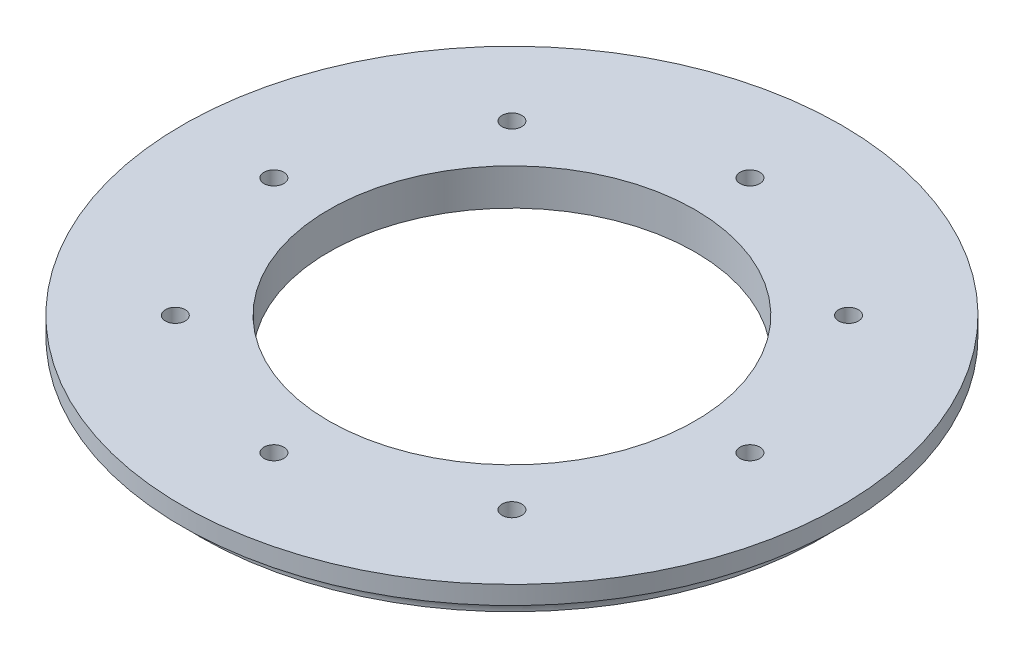
ISO-10303-21;
HEADER;
FILE_DESCRIPTION(('STEP AP214'),'2;1');
FILE_NAME('part.step','',(''),(''),'','','');
FILE_SCHEMA(('AUTOMOTIVE_DESIGN { 1 0 10303 214 1 1 1 1 }'));
ENDSEC;
DATA;
#1=APPLICATION_CONTEXT('core data for automotive mechanical design processes');
#2=APPLICATION_PROTOCOL_DEFINITION('international standard','automotive_design',2000,#1);
#3=PRODUCT_CONTEXT('',#1,'mechanical');
#4=PRODUCT('Part','Part','',(#3));
#5=PRODUCT_RELATED_PRODUCT_CATEGORY('part','',(#4));
#6=PRODUCT_DEFINITION_FORMATION('','',#4);
#7=PRODUCT_DEFINITION_CONTEXT('part definition',#1,'design');
#8=PRODUCT_DEFINITION('design','',#6,#7);
#9=PRODUCT_DEFINITION_SHAPE('','',#8);
#10=(LENGTH_UNIT() NAMED_UNIT(*) SI_UNIT(.MILLI.,.METRE.));
#11=(NAMED_UNIT(*) PLANE_ANGLE_UNIT() SI_UNIT($,.RADIAN.));
#12=(NAMED_UNIT(*) SI_UNIT($,.STERADIAN.) SOLID_ANGLE_UNIT());
#13=UNCERTAINTY_MEASURE_WITH_UNIT(LENGTH_MEASURE(1.E-05),#10,'distance_accuracy_value','');
#14=(GEOMETRIC_REPRESENTATION_CONTEXT(3) GLOBAL_UNCERTAINTY_ASSIGNED_CONTEXT((#13)) GLOBAL_UNIT_ASSIGNED_CONTEXT((#10,
#11,#12)) REPRESENTATION_CONTEXT('',''));
#15=CARTESIAN_POINT('',(0.,0.,0.));
#16=DIRECTION('',(0.,0.,1.));
#17=DIRECTION('',(1.,0.,0.));
#18=AXIS2_PLACEMENT_3D('',#15,#16,#17);
#19=CARTESIAN_POINT('',(0.,0.,0.));
#20=DIRECTION('',(0.,-1.,0.));
#21=DIRECTION('',(0.,0.,-1.));
#22=AXIS2_PLACEMENT_3D('',#19,#20,#21);
#23=TOROIDAL_SURFACE('',#22,45.,2.5);
#24=CARTESIAN_POINT('',(0.,2.5,0.));
#25=DIRECTION('',(0.,-1.,0.));
#26=DIRECTION('',(0.,0.,-1.));
#27=AXIS2_PLACEMENT_3D('',#24,#25,#26);
#28=CIRCLE('',#27,45.);
#29=CARTESIAN_POINT('',(0.,2.5,-45.));
#30=VERTEX_POINT('',#29);
#31=EDGE_CURVE('E43',#30,#30,#28,.T.);
#32=ORIENTED_EDGE('',*,*,#31,.T.);
#33=EDGE_LOOP('',(#32));
#34=FACE_BOUND('',#33,.T.);
#35=CARTESIAN_POINT('',(0.,0.,0.));
#36=DIRECTION('',(0.,-1.,0.));
#37=DIRECTION('',(0.,0.,-1.));
#38=AXIS2_PLACEMENT_3D('',#35,#36,#37);
#39=CIRCLE('',#38,42.5);
#40=CARTESIAN_POINT('',(0.,0.,-42.5));
#41=VERTEX_POINT('',#40);
#42=EDGE_CURVE('E10',#41,#41,#39,.T.);
#43=ORIENTED_EDGE('',*,*,#42,.F.);
#44=EDGE_LOOP('',(#43));
#45=FACE_BOUND('',#44,.T.);
#46=ADVANCED_FACE('F33',(#34,#45),#23,.F.);
#47=CARTESIAN_POINT('',(0.,0.,0.));
#48=DIRECTION('',(0.,-1.,0.));
#49=DIRECTION('',(0.,0.,-1.));
#50=AXIS2_PLACEMENT_3D('',#47,#48,#49);
#51=PLANE('',#50);
#52=CARTESIAN_POINT('',(0.,0.,0.));
#53=DIRECTION('',(0.,1.,0.));
#54=DIRECTION('',(0.,0.,1.));
#55=AXIS2_PLACEMENT_3D('',#52,#53,#54);
#56=CIRCLE('',#55,25.);
#57=CARTESIAN_POINT('',(0.,0.,25.));
#58=VERTEX_POINT('',#57);
#59=EDGE_CURVE('E54',#58,#58,#56,.T.);
#60=ORIENTED_EDGE('',*,*,#59,.T.);
#61=EDGE_LOOP('',(#60));
#62=FACE_BOUND('',#61,.T.);
#63=CARTESIAN_POINT('',(0.,0.,-32.5));
#64=DIRECTION('',(0.,1.,0.));
#65=DIRECTION('',(0.,0.,1.));
#66=AXIS2_PLACEMENT_3D('',#63,#64,#65);
#67=CIRCLE('',#66,1.35);
#68=CARTESIAN_POINT('',(0.,0.,-31.15));
#69=VERTEX_POINT('',#68);
#70=EDGE_CURVE('E47',#69,#69,#67,.T.);
#71=ORIENTED_EDGE('',*,*,#70,.T.);
#72=EDGE_LOOP('',(#71));
#73=FACE_BOUND('',#72,.T.);
#74=CARTESIAN_POINT('',(22.9809703885635,0.,-22.9809703885646));
#75=DIRECTION('',(0.,1.,0.));
#76=DIRECTION('',(0.,0.,1.));
#77=AXIS2_PLACEMENT_3D('',#74,#75,#76);
#78=CIRCLE('',#77,1.35);
#79=CARTESIAN_POINT('',(22.9809703885635,0.,-21.6309703885646));
#80=VERTEX_POINT('',#79);
#81=EDGE_CURVE('E90',#80,#80,#78,.T.);
#82=ORIENTED_EDGE('',*,*,#81,.T.);
#83=EDGE_LOOP('',(#82));
#84=FACE_BOUND('',#83,.T.);
#85=CARTESIAN_POINT('',(32.5000000000026,0.,-2.55443298918881E-12));
#86=DIRECTION('',(0.,1.,0.));
#87=DIRECTION('',(0.,0.,1.));
#88=AXIS2_PLACEMENT_3D('',#85,#86,#87);
#89=CIRCLE('',#88,1.35);
#90=CARTESIAN_POINT('',(32.5000000000026,0.,1.34999999999744));
#91=VERTEX_POINT('',#90);
#92=EDGE_CURVE('E84',#91,#91,#89,.T.);
#93=ORIENTED_EDGE('',*,*,#92,.T.);
#94=EDGE_LOOP('',(#93));
#95=FACE_BOUND('',#94,.T.);
#96=CARTESIAN_POINT('',(22.9809703885672,0.,22.980970388561));
#97=DIRECTION('',(0.,1.,0.));
#98=DIRECTION('',(0.,0.,1.));
#99=AXIS2_PLACEMENT_3D('',#96,#97,#98);
#100=CIRCLE('',#99,1.35);
#101=CARTESIAN_POINT('',(22.9809703885672,0.,24.330970388561));
#102=VERTEX_POINT('',#101);
#103=EDGE_CURVE('E78',#102,#102,#100,.T.);
#104=ORIENTED_EDGE('',*,*,#103,.T.);
#105=EDGE_LOOP('',(#104));
#106=FACE_BOUND('',#105,.T.);
#107=CARTESIAN_POINT('',(5.10886597837762E-12,0.,32.5));
#108=DIRECTION('',(0.,1.,0.));
#109=DIRECTION('',(0.,0.,1.));
#110=AXIS2_PLACEMENT_3D('',#107,#108,#109);
#111=CIRCLE('',#110,1.35);
#112=CARTESIAN_POINT('',(5.10886597837762E-12,0.,33.85));
#113=VERTEX_POINT('',#112);
#114=EDGE_CURVE('E72',#113,#113,#111,.T.);
#115=ORIENTED_EDGE('',*,*,#114,.T.);
#116=EDGE_LOOP('',(#115));
#117=FACE_BOUND('',#116,.T.);
#118=CARTESIAN_POINT('',(-22.9809703885584,0.,22.9809703885646));
#119=DIRECTION('',(0.,1.,0.));
#120=DIRECTION('',(0.,0.,1.));
#121=AXIS2_PLACEMENT_3D('',#118,#119,#120);
#122=CIRCLE('',#121,1.35);
#123=CARTESIAN_POINT('',(-22.9809703885584,0.,24.3309703885646));
#124=VERTEX_POINT('',#123);
#125=EDGE_CURVE('E66',#124,#124,#122,.T.);
#126=ORIENTED_EDGE('',*,*,#125,.T.);
#127=EDGE_LOOP('',(#126));
#128=FACE_BOUND('',#127,.T.);
#129=CARTESIAN_POINT('',(-32.4999999999974,0.,2.55841309128604E-12));
#130=DIRECTION('',(0.,1.,0.));
#131=DIRECTION('',(0.,0.,1.));
#132=AXIS2_PLACEMENT_3D('',#129,#130,#131);
#133=CIRCLE('',#132,1.35);
#134=CARTESIAN_POINT('',(-32.4999999999974,0.,1.35000000000256));
#135=VERTEX_POINT('',#134);
#136=EDGE_CURVE('E60',#135,#135,#133,.T.);
#137=ORIENTED_EDGE('',*,*,#136,.T.);
#138=EDGE_LOOP('',(#137));
#139=FACE_BOUND('',#138,.T.);
#140=CARTESIAN_POINT('',(-22.9809703885621,0.,-22.980970388561));
#141=DIRECTION('',(0.,1.,0.));
#142=DIRECTION('',(0.,0.,1.));
#143=AXIS2_PLACEMENT_3D('',#140,#141,#142);
#144=CIRCLE('',#143,1.35);
#145=CARTESIAN_POINT('',(-22.9809703885621,0.,-21.630970388561));
#146=VERTEX_POINT('',#145);
#147=EDGE_CURVE('E53',#146,#146,#144,.T.);
#148=ORIENTED_EDGE('',*,*,#147,.T.);
#149=EDGE_LOOP('',(#148));
#150=FACE_BOUND('',#149,.T.);
#151=ORIENTED_EDGE('',*,*,#42,.T.);
#152=EDGE_LOOP('',(#151));
#153=FACE_BOUND('',#152,.T.);
#154=ADVANCED_FACE('F104',(#62,#73,#84,#95,#106,#117,#128,#139,#150,#153),#51,.T.);
#155=CARTESIAN_POINT('',(0.,5.,0.));
#156=DIRECTION('',(0.,-1.,0.));
#157=DIRECTION('',(0.,0.,-1.));
#158=AXIS2_PLACEMENT_3D('',#155,#156,#157);
#159=PLANE('',#158);
#160=CARTESIAN_POINT('',(0.,5.,0.));
#161=DIRECTION('',(0.,1.,0.));
#162=DIRECTION('',(0.,0.,1.));
#163=AXIS2_PLACEMENT_3D('',#160,#161,#162);
#164=CIRCLE('',#163,25.);
#165=CARTESIAN_POINT('',(0.,5.,25.));
#166=VERTEX_POINT('',#165);
#167=EDGE_CURVE('E98',#166,#166,#164,.T.);
#168=ORIENTED_EDGE('',*,*,#167,.F.);
#169=EDGE_LOOP('',(#168));
#170=FACE_BOUND('',#169,.T.);
#171=CARTESIAN_POINT('',(0.,5.,-32.5));
#172=DIRECTION('',(0.,1.,0.));
#173=DIRECTION('',(0.,0.,1.));
#174=AXIS2_PLACEMENT_3D('',#171,#172,#173);
#175=CIRCLE('',#174,1.35);
#176=CARTESIAN_POINT('',(0.,5.,-31.15));
#177=VERTEX_POINT('',#176);
#178=EDGE_CURVE('E93',#177,#177,#175,.T.);
#179=ORIENTED_EDGE('',*,*,#178,.F.);
#180=EDGE_LOOP('',(#179));
#181=FACE_BOUND('',#180,.T.);
#182=CARTESIAN_POINT('',(22.9809703885635,5.,-22.9809703885646));
#183=DIRECTION('',(0.,1.,0.));
#184=DIRECTION('',(0.,0.,1.));
#185=AXIS2_PLACEMENT_3D('',#182,#183,#184);
#186=CIRCLE('',#185,1.35);
#187=CARTESIAN_POINT('',(22.9809703885635,5.,-21.6309703885646));
#188=VERTEX_POINT('',#187);
#189=EDGE_CURVE('E87',#188,#188,#186,.T.);
#190=ORIENTED_EDGE('',*,*,#189,.F.);
#191=EDGE_LOOP('',(#190));
#192=FACE_BOUND('',#191,.T.);
#193=CARTESIAN_POINT('',(32.5000000000026,5.,-2.55443298918881E-12));
#194=DIRECTION('',(0.,1.,0.));
#195=DIRECTION('',(0.,0.,1.));
#196=AXIS2_PLACEMENT_3D('',#193,#194,#195);
#197=CIRCLE('',#196,1.35);
#198=CARTESIAN_POINT('',(32.5000000000026,5.,1.34999999999744));
#199=VERTEX_POINT('',#198);
#200=EDGE_CURVE('E81',#199,#199,#197,.T.);
#201=ORIENTED_EDGE('',*,*,#200,.F.);
#202=EDGE_LOOP('',(#201));
#203=FACE_BOUND('',#202,.T.);
#204=CARTESIAN_POINT('',(22.9809703885672,5.,22.980970388561));
#205=DIRECTION('',(0.,1.,0.));
#206=DIRECTION('',(0.,0.,1.));
#207=AXIS2_PLACEMENT_3D('',#204,#205,#206);
#208=CIRCLE('',#207,1.35);
#209=CARTESIAN_POINT('',(22.9809703885672,5.,24.330970388561));
#210=VERTEX_POINT('',#209);
#211=EDGE_CURVE('E75',#210,#210,#208,.T.);
#212=ORIENTED_EDGE('',*,*,#211,.F.);
#213=EDGE_LOOP('',(#212));
#214=FACE_BOUND('',#213,.T.);
#215=CARTESIAN_POINT('',(5.10886597837762E-12,5.,32.5));
#216=DIRECTION('',(0.,1.,0.));
#217=DIRECTION('',(0.,0.,1.));
#218=AXIS2_PLACEMENT_3D('',#215,#216,#217);
#219=CIRCLE('',#218,1.35);
#220=CARTESIAN_POINT('',(5.10886597837762E-12,5.,33.85));
#221=VERTEX_POINT('',#220);
#222=EDGE_CURVE('E69',#221,#221,#219,.T.);
#223=ORIENTED_EDGE('',*,*,#222,.F.);
#224=EDGE_LOOP('',(#223));
#225=FACE_BOUND('',#224,.T.);
#226=CARTESIAN_POINT('',(-22.9809703885584,5.,22.9809703885646));
#227=DIRECTION('',(0.,1.,0.));
#228=DIRECTION('',(0.,0.,1.));
#229=AXIS2_PLACEMENT_3D('',#226,#227,#228);
#230=CIRCLE('',#229,1.35);
#231=CARTESIAN_POINT('',(-22.9809703885584,5.,24.3309703885646));
#232=VERTEX_POINT('',#231);
#233=EDGE_CURVE('E63',#232,#232,#230,.T.);
#234=ORIENTED_EDGE('',*,*,#233,.F.);
#235=EDGE_LOOP('',(#234));
#236=FACE_BOUND('',#235,.T.);
#237=CARTESIAN_POINT('',(-32.4999999999974,5.,2.55841309128604E-12));
#238=DIRECTION('',(0.,1.,0.));
#239=DIRECTION('',(0.,0.,1.));
#240=AXIS2_PLACEMENT_3D('',#237,#238,#239);
#241=CIRCLE('',#240,1.35);
#242=CARTESIAN_POINT('',(-32.4999999999974,5.,1.35000000000256));
#243=VERTEX_POINT('',#242);
#244=EDGE_CURVE('E57',#243,#243,#241,.T.);
#245=ORIENTED_EDGE('',*,*,#244,.F.);
#246=EDGE_LOOP('',(#245));
#247=FACE_BOUND('',#246,.T.);
#248=CARTESIAN_POINT('',(-22.9809703885621,5.,-22.980970388561));
#249=DIRECTION('',(0.,1.,0.));
#250=DIRECTION('',(0.,0.,1.));
#251=AXIS2_PLACEMENT_3D('',#248,#249,#250);
#252=CIRCLE('',#251,1.35);
#253=CARTESIAN_POINT('',(-22.9809703885621,5.,-21.630970388561));
#254=VERTEX_POINT('',#253);
#255=EDGE_CURVE('E50',#254,#254,#252,.T.);
#256=ORIENTED_EDGE('',*,*,#255,.F.);
#257=EDGE_LOOP('',(#256));
#258=FACE_BOUND('',#257,.T.);
#259=CARTESIAN_POINT('',(0.,4.99999999999999,0.));
#260=DIRECTION('',(0.,-1.,0.));
#261=DIRECTION('',(0.,0.,-1.));
#262=AXIS2_PLACEMENT_3D('',#259,#260,#261);
#263=CIRCLE('',#262,45.);
#264=CARTESIAN_POINT('',(0.,4.99999999999999,-45.));
#265=VERTEX_POINT('',#264);
#266=EDGE_CURVE('E39',#265,#265,#263,.T.);
#267=ORIENTED_EDGE('',*,*,#266,.F.);
#268=EDGE_LOOP('',(#267));
#269=FACE_BOUND('',#268,.T.);
#270=ADVANCED_FACE('F114',(#170,#181,#192,#203,#214,#225,#236,#247,#258,#269),#159,.F.);
#271=CARTESIAN_POINT('',(0.,0.,0.));
#272=DIRECTION('',(0.,-1.,0.));
#273=DIRECTION('',(0.,0.,-1.));
#274=AXIS2_PLACEMENT_3D('',#271,#272,#273);
#275=CYLINDRICAL_SURFACE('',#274,45.);
#276=ORIENTED_EDGE('',*,*,#266,.T.);
#277=EDGE_LOOP('',(#276));
#278=FACE_BOUND('',#277,.T.);
#279=ORIENTED_EDGE('',*,*,#31,.F.);
#280=EDGE_LOOP('',(#279));
#281=FACE_BOUND('',#280,.T.);
#282=ADVANCED_FACE('F117',(#278,#281),#275,.T.);
#283=CARTESIAN_POINT('',(-22.9809703885621,0.,-22.980970388561));
#284=DIRECTION('',(0.,1.,0.));
#285=DIRECTION('',(0.,0.,1.));
#286=AXIS2_PLACEMENT_3D('',#283,#284,#285);
#287=CYLINDRICAL_SURFACE('',#286,1.35);
#288=ORIENTED_EDGE('',*,*,#147,.F.);
#289=EDGE_LOOP('',(#288));
#290=FACE_BOUND('',#289,.T.);
#291=ORIENTED_EDGE('',*,*,#255,.T.);
#292=EDGE_LOOP('',(#291));
#293=FACE_BOUND('',#292,.T.);
#294=ADVANCED_FACE('F136',(#290,#293),#287,.F.);
#295=CARTESIAN_POINT('',(-32.4999999999974,0.,2.55841309128604E-12));
#296=DIRECTION('',(0.,1.,0.));
#297=DIRECTION('',(0.,0.,1.));
#298=AXIS2_PLACEMENT_3D('',#295,#296,#297);
#299=CYLINDRICAL_SURFACE('',#298,1.35);
#300=ORIENTED_EDGE('',*,*,#136,.F.);
#301=EDGE_LOOP('',(#300));
#302=FACE_BOUND('',#301,.T.);
#303=ORIENTED_EDGE('',*,*,#244,.T.);
#304=EDGE_LOOP('',(#303));
#305=FACE_BOUND('',#304,.T.);
#306=ADVANCED_FACE('F138',(#302,#305),#299,.F.);
#307=CARTESIAN_POINT('',(-22.9809703885584,0.,22.9809703885646));
#308=DIRECTION('',(0.,1.,0.));
#309=DIRECTION('',(0.,0.,1.));
#310=AXIS2_PLACEMENT_3D('',#307,#308,#309);
#311=CYLINDRICAL_SURFACE('',#310,1.35);
#312=ORIENTED_EDGE('',*,*,#125,.F.);
#313=EDGE_LOOP('',(#312));
#314=FACE_BOUND('',#313,.T.);
#315=ORIENTED_EDGE('',*,*,#233,.T.);
#316=EDGE_LOOP('',(#315));
#317=FACE_BOUND('',#316,.T.);
#318=ADVANCED_FACE('F145',(#314,#317),#311,.F.);
#319=CARTESIAN_POINT('',(5.10886597837762E-12,0.,32.5));
#320=DIRECTION('',(0.,1.,0.));
#321=DIRECTION('',(0.,0.,1.));
#322=AXIS2_PLACEMENT_3D('',#319,#320,#321);
#323=CYLINDRICAL_SURFACE('',#322,1.35);
#324=ORIENTED_EDGE('',*,*,#114,.F.);
#325=EDGE_LOOP('',(#324));
#326=FACE_BOUND('',#325,.T.);
#327=ORIENTED_EDGE('',*,*,#222,.T.);
#328=EDGE_LOOP('',(#327));
#329=FACE_BOUND('',#328,.T.);
#330=ADVANCED_FACE('F191',(#326,#329),#323,.F.);
#331=CARTESIAN_POINT('',(22.9809703885672,0.,22.980970388561));
#332=DIRECTION('',(0.,1.,0.));
#333=DIRECTION('',(0.,0.,1.));
#334=AXIS2_PLACEMENT_3D('',#331,#332,#333);
#335=CYLINDRICAL_SURFACE('',#334,1.35);
#336=ORIENTED_EDGE('',*,*,#103,.F.);
#337=EDGE_LOOP('',(#336));
#338=FACE_BOUND('',#337,.T.);
#339=ORIENTED_EDGE('',*,*,#211,.T.);
#340=EDGE_LOOP('',(#339));
#341=FACE_BOUND('',#340,.T.);
#342=ADVANCED_FACE('F201',(#338,#341),#335,.F.);
#343=CARTESIAN_POINT('',(32.5000000000026,0.,-2.55443298918881E-12));
#344=DIRECTION('',(0.,1.,0.));
#345=DIRECTION('',(0.,0.,1.));
#346=AXIS2_PLACEMENT_3D('',#343,#344,#345);
#347=CYLINDRICAL_SURFACE('',#346,1.35);
#348=ORIENTED_EDGE('',*,*,#92,.F.);
#349=EDGE_LOOP('',(#348));
#350=FACE_BOUND('',#349,.T.);
#351=ORIENTED_EDGE('',*,*,#200,.T.);
#352=EDGE_LOOP('',(#351));
#353=FACE_BOUND('',#352,.T.);
#354=ADVANCED_FACE('F211',(#350,#353),#347,.F.);
#355=CARTESIAN_POINT('',(22.9809703885635,0.,-22.9809703885646));
#356=DIRECTION('',(0.,1.,0.));
#357=DIRECTION('',(0.,0.,1.));
#358=AXIS2_PLACEMENT_3D('',#355,#356,#357);
#359=CYLINDRICAL_SURFACE('',#358,1.35);
#360=ORIENTED_EDGE('',*,*,#81,.F.);
#361=EDGE_LOOP('',(#360));
#362=FACE_BOUND('',#361,.T.);
#363=ORIENTED_EDGE('',*,*,#189,.T.);
#364=EDGE_LOOP('',(#363));
#365=FACE_BOUND('',#364,.T.);
#366=ADVANCED_FACE('F221',(#362,#365),#359,.F.);
#367=CARTESIAN_POINT('',(0.,0.,-32.5));
#368=DIRECTION('',(0.,1.,0.));
#369=DIRECTION('',(0.,0.,1.));
#370=AXIS2_PLACEMENT_3D('',#367,#368,#369);
#371=CYLINDRICAL_SURFACE('',#370,1.35);
#372=ORIENTED_EDGE('',*,*,#70,.F.);
#373=EDGE_LOOP('',(#372));
#374=FACE_BOUND('',#373,.T.);
#375=ORIENTED_EDGE('',*,*,#178,.T.);
#376=EDGE_LOOP('',(#375));
#377=FACE_BOUND('',#376,.T.);
#378=ADVANCED_FACE('F110',(#374,#377),#371,.F.);
#379=CARTESIAN_POINT('',(0.,0.,0.));
#380=DIRECTION('',(0.,1.,0.));
#381=DIRECTION('',(0.,0.,1.));
#382=AXIS2_PLACEMENT_3D('',#379,#380,#381);
#383=CYLINDRICAL_SURFACE('',#382,25.);
#384=ORIENTED_EDGE('',*,*,#59,.F.);
#385=EDGE_LOOP('',(#384));
#386=FACE_BOUND('',#385,.T.);
#387=ORIENTED_EDGE('',*,*,#167,.T.);
#388=EDGE_LOOP('',(#387));
#389=FACE_BOUND('',#388,.T.);
#390=ADVANCED_FACE('F107',(#386,#389),#383,.F.);
#391=CLOSED_SHELL('',(#46,#154,#270,#282,#294,#306,#318,#330,#342,#354,#366,#378,#390));
#392=MANIFOLD_SOLID_BREP('B2',#391);
#393=ADVANCED_BREP_SHAPE_REPRESENTATION('',(#18,#392),#14);
#394=SHAPE_DEFINITION_REPRESENTATION(#9,#393);
ENDSEC;
END-ISO-10303-21;
